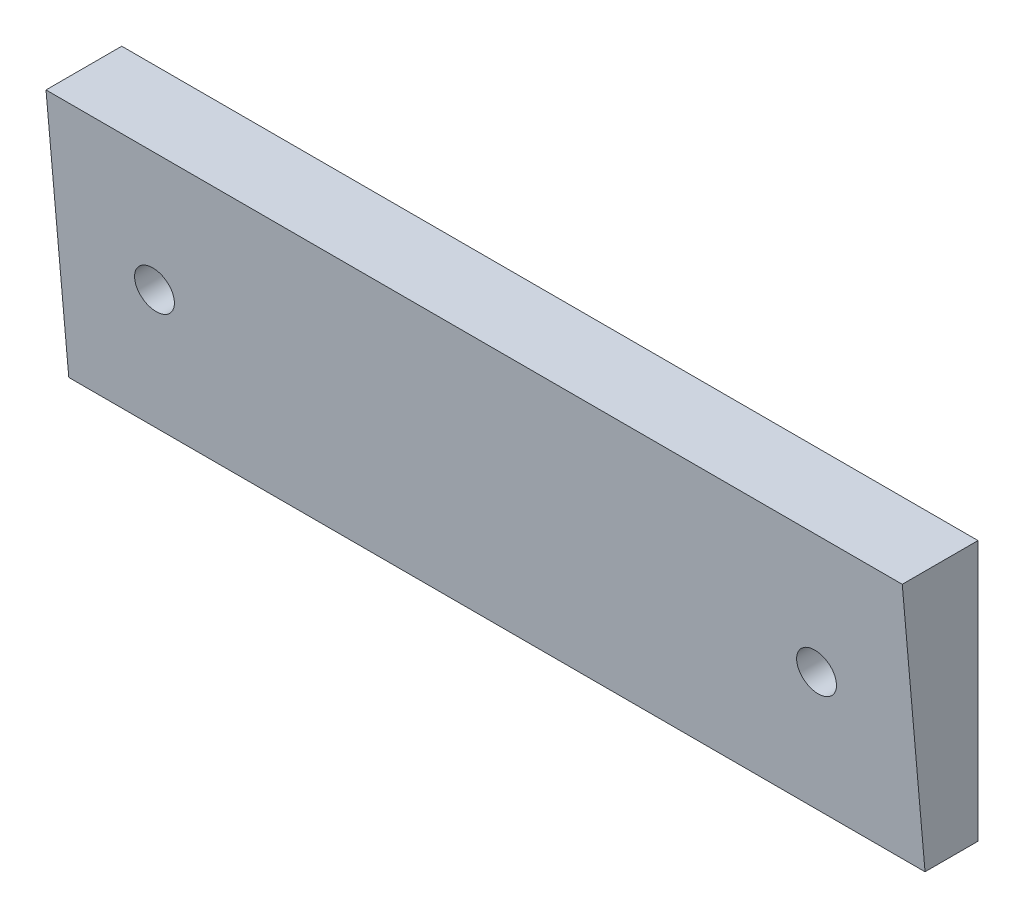
ISO-10303-21;
HEADER;
FILE_DESCRIPTION(('STEP AP214'),'2;1');
FILE_NAME('part.step','',(''),(''),'','','');
FILE_SCHEMA(('AUTOMOTIVE_DESIGN { 1 0 10303 214 1 1 1 1 }'));
ENDSEC;
DATA;
#1=APPLICATION_CONTEXT('core data for automotive mechanical design processes');
#2=APPLICATION_PROTOCOL_DEFINITION('international standard','automotive_design',2000,#1);
#3=PRODUCT_CONTEXT('',#1,'mechanical');
#4=PRODUCT('Part','Part','',(#3));
#5=PRODUCT_RELATED_PRODUCT_CATEGORY('part','',(#4));
#6=PRODUCT_DEFINITION_FORMATION('','',#4);
#7=PRODUCT_DEFINITION_CONTEXT('part definition',#1,'design');
#8=PRODUCT_DEFINITION('design','',#6,#7);
#9=PRODUCT_DEFINITION_SHAPE('','',#8);
#10=(LENGTH_UNIT() NAMED_UNIT(*) SI_UNIT(.MILLI.,.METRE.));
#11=(NAMED_UNIT(*) PLANE_ANGLE_UNIT() SI_UNIT($,.RADIAN.));
#12=(NAMED_UNIT(*) SI_UNIT($,.STERADIAN.) SOLID_ANGLE_UNIT());
#13=UNCERTAINTY_MEASURE_WITH_UNIT(LENGTH_MEASURE(1.E-05),#10,'distance_accuracy_value','');
#14=(GEOMETRIC_REPRESENTATION_CONTEXT(3) GLOBAL_UNCERTAINTY_ASSIGNED_CONTEXT((#13)) GLOBAL_UNIT_ASSIGNED_CONTEXT((#10,
#11,#12)) REPRESENTATION_CONTEXT('',''));
#15=CARTESIAN_POINT('',(0.,0.,0.));
#16=DIRECTION('',(0.,0.,1.));
#17=DIRECTION('',(1.,0.,0.));
#18=AXIS2_PLACEMENT_3D('',#15,#16,#17);
#19=CARTESIAN_POINT('',(48.5,10.,0.));
#20=DIRECTION('',(0.,0.,1.));
#21=DIRECTION('',(1.,0.,0.));
#22=AXIS2_PLACEMENT_3D('',#19,#20,#21);
#23=PLANE('',#22);
#24=CARTESIAN_POINT('',(37.5,-4.75,0.));
#25=DIRECTION('',(0.,0.,1.));
#26=DIRECTION('',(1.,0.,0.));
#27=AXIS2_PLACEMENT_3D('',#24,#25,#26);
#28=CIRCLE('',#27,2.25);
#29=CARTESIAN_POINT('',(39.75,-4.75,0.));
#30=VERTEX_POINT('',#29);
#31=EDGE_CURVE('E113',#30,#30,#28,.T.);
#32=ORIENTED_EDGE('',*,*,#31,.T.);
#33=EDGE_LOOP('',(#32));
#34=FACE_BOUND('',#33,.T.);
#35=CARTESIAN_POINT('',(-37.5,-4.75,0.));
#36=DIRECTION('',(0.,0.,1.));
#37=DIRECTION('',(1.,0.,0.));
#38=AXIS2_PLACEMENT_3D('',#35,#36,#37);
#39=CIRCLE('',#38,2.25);
#40=CARTESIAN_POINT('',(-35.25,-4.75,0.));
#41=VERTEX_POINT('',#40);
#42=EDGE_CURVE('E122',#41,#41,#39,.T.);
#43=ORIENTED_EDGE('',*,*,#42,.T.);
#44=EDGE_LOOP('',(#43));
#45=FACE_BOUND('',#44,.T.);
#46=CARTESIAN_POINT('',(15.,0.,0.));
#47=DIRECTION('',(0.,0.,1.));
#48=DIRECTION('',(1.,0.,0.));
#49=AXIS2_PLACEMENT_3D('',#46,#47,#48);
#50=CIRCLE('',#49,2.);
#51=CARTESIAN_POINT('',(17.,0.,0.));
#52=VERTEX_POINT('',#51);
#53=EDGE_CURVE('E128',#52,#52,#50,.T.);
#54=ORIENTED_EDGE('',*,*,#53,.T.);
#55=EDGE_LOOP('',(#54));
#56=FACE_BOUND('',#55,.T.);
#57=CARTESIAN_POINT('',(-15.,0.,0.));
#58=DIRECTION('',(0.,0.,1.));
#59=DIRECTION('',(1.,0.,0.));
#60=AXIS2_PLACEMENT_3D('',#57,#58,#59);
#61=CIRCLE('',#60,2.);
#62=CARTESIAN_POINT('',(-13.,0.,0.));
#63=VERTEX_POINT('',#62);
#64=EDGE_CURVE('E133',#63,#63,#61,.T.);
#65=ORIENTED_EDGE('',*,*,#64,.T.);
#66=EDGE_LOOP('',(#65));
#67=FACE_BOUND('',#66,.T.);
#68=DIRECTION('',(0.,1.,0.));
#69=VECTOR('',#68,1.);
#70=CARTESIAN_POINT('',(-48.5,10.,0.));
#71=LINE('',#70,#69);
#72=CARTESIAN_POINT('',(-48.5,-19.5,0.));
#73=VERTEX_POINT('',#72);
#74=CARTESIAN_POINT('',(-48.5,10.,0.));
#75=VERTEX_POINT('',#74);
#76=EDGE_CURVE('E104',#73,#75,#71,.T.);
#77=ORIENTED_EDGE('',*,*,#76,.T.);
#78=DIRECTION('',(-1.,0.,0.));
#79=VECTOR('',#78,1.);
#80=CARTESIAN_POINT('',(48.5,10.,0.));
#81=LINE('',#80,#79);
#82=CARTESIAN_POINT('',(48.5,10.,0.));
#83=VERTEX_POINT('',#82);
#84=EDGE_CURVE('E11',#83,#75,#81,.T.);
#85=ORIENTED_EDGE('',*,*,#84,.F.);
#86=DIRECTION('',(0.,1.,0.));
#87=VECTOR('',#86,1.);
#88=CARTESIAN_POINT('',(48.5,10.,0.));
#89=LINE('',#88,#87);
#90=CARTESIAN_POINT('',(48.5,-19.5,0.));
#91=VERTEX_POINT('',#90);
#92=EDGE_CURVE('E95',#91,#83,#89,.T.);
#93=ORIENTED_EDGE('',*,*,#92,.F.);
#94=DIRECTION('',(-1.,0.,0.));
#95=VECTOR('',#94,1.);
#96=CARTESIAN_POINT('',(48.5,-19.5,0.));
#97=LINE('',#96,#95);
#98=EDGE_CURVE('E101',#91,#73,#97,.T.);
#99=ORIENTED_EDGE('',*,*,#98,.T.);
#100=EDGE_LOOP('',(#77,#85,#93,#99));
#101=FACE_BOUND('',#100,.T.);
#102=ADVANCED_FACE('F39',(#34,#45,#56,#67,#101),#23,.F.);
#103=CARTESIAN_POINT('',(48.5,10.,8.58091557401476));
#104=DIRECTION('',(0.,-1.,0.));
#105=DIRECTION('',(0.,0.,-1.));
#106=AXIS2_PLACEMENT_3D('',#103,#104,#105);
#107=PLANE('',#106);
#108=DIRECTION('',(0.,0.,1.));
#109=VECTOR('',#108,1.);
#110=CARTESIAN_POINT('',(-48.5,10.,8.58091557401476));
#111=LINE('',#110,#109);
#112=CARTESIAN_POINT('',(-48.5,10.,8.58091557401476));
#113=VERTEX_POINT('',#112);
#114=EDGE_CURVE('E96',#75,#113,#111,.T.);
#115=ORIENTED_EDGE('',*,*,#114,.T.);
#116=DIRECTION('',(-1.,0.,0.));
#117=VECTOR('',#116,1.);
#118=CARTESIAN_POINT('',(48.5,10.,8.58091557401476));
#119=LINE('',#118,#117);
#120=CARTESIAN_POINT('',(48.5,10.,8.58091557401476));
#121=VERTEX_POINT('',#120);
#122=EDGE_CURVE('E48',#121,#113,#119,.T.);
#123=ORIENTED_EDGE('',*,*,#122,.F.);
#124=DIRECTION('',(0.,0.,1.));
#125=VECTOR('',#124,1.);
#126=CARTESIAN_POINT('',(48.5,10.,8.58091557401476));
#127=LINE('',#126,#125);
#128=EDGE_CURVE('E87',#83,#121,#127,.T.);
#129=ORIENTED_EDGE('',*,*,#128,.F.);
#130=ORIENTED_EDGE('',*,*,#84,.T.);
#131=EDGE_LOOP('',(#115,#123,#129,#130));
#132=FACE_BOUND('',#131,.T.);
#133=ADVANCED_FACE('F92',(#132),#107,.F.);
#134=CARTESIAN_POINT('',(48.5,-19.5,6.));
#135=DIRECTION('',(0.,0.0871557427476582,-0.996194698091745));
#136=DIRECTION('',(0.,0.996194698091746,0.0871557427476582));
#137=AXIS2_PLACEMENT_3D('',#134,#135,#136);
#138=PLANE('',#137);
#139=CARTESIAN_POINT('',(37.5,-4.75,7.29045778700738));
#140=DIRECTION('',(0.,0.0871557427476582,-0.996194698091745));
#141=DIRECTION('',(0.,-0.996194698091746,-0.0871557427476582));
#142=AXIS2_PLACEMENT_3D('',#139,#140,#141);
#143=ELLIPSE('',#142,2.25859463447253,2.25);
#144=CARTESIAN_POINT('',(37.5,-7.,7.09360829407405));
#145=VERTEX_POINT('',#144);
#146=EDGE_CURVE('E45',#145,#145,#143,.F.);
#147=ORIENTED_EDGE('',*,*,#146,.F.);
#148=EDGE_LOOP('',(#147));
#149=FACE_BOUND('',#148,.T.);
#150=CARTESIAN_POINT('',(-37.5,-4.75,7.29045778700738));
#151=DIRECTION('',(0.,0.0871557427476582,-0.996194698091745));
#152=DIRECTION('',(0.,-0.996194698091746,-0.0871557427476582));
#153=AXIS2_PLACEMENT_3D('',#150,#151,#152);
#154=ELLIPSE('',#153,2.25859463447253,2.25);
#155=CARTESIAN_POINT('',(-37.5,-7.,7.09360829407405));
#156=VERTEX_POINT('',#155);
#157=EDGE_CURVE('E114',#156,#156,#154,.F.);
#158=ORIENTED_EDGE('',*,*,#157,.F.);
#159=EDGE_LOOP('',(#158));
#160=FACE_BOUND('',#159,.T.);
#161=DIRECTION('',(0.,-0.996194698091745,-0.0871557427476582));
#162=VECTOR('',#161,1.);
#163=CARTESIAN_POINT('',(-48.5,-19.5,6.));
#164=LINE('',#163,#162);
#165=CARTESIAN_POINT('',(-48.5,-19.5,6.));
#166=VERTEX_POINT('',#165);
#167=EDGE_CURVE('E74',#113,#166,#164,.T.);
#168=ORIENTED_EDGE('',*,*,#167,.T.);
#169=DIRECTION('',(-1.,0.,0.));
#170=VECTOR('',#169,1.);
#171=CARTESIAN_POINT('',(48.5,-19.5,6.));
#172=LINE('',#171,#170);
#173=CARTESIAN_POINT('',(48.5,-19.5,6.));
#174=VERTEX_POINT('',#173);
#175=EDGE_CURVE('E100',#174,#166,#172,.T.);
#176=ORIENTED_EDGE('',*,*,#175,.F.);
#177=DIRECTION('',(0.,-0.996194698091745,-0.0871557427476582));
#178=VECTOR('',#177,1.);
#179=CARTESIAN_POINT('',(48.5,-19.5,6.));
#180=LINE('',#179,#178);
#181=EDGE_CURVE('E89',#121,#174,#180,.T.);
#182=ORIENTED_EDGE('',*,*,#181,.F.);
#183=ORIENTED_EDGE('',*,*,#122,.T.);
#184=EDGE_LOOP('',(#168,#176,#182,#183));
#185=FACE_BOUND('',#184,.T.);
#186=ADVANCED_FACE('F97',(#149,#160,#185),#138,.F.);
#187=CARTESIAN_POINT('',(48.5,-19.5,0.));
#188=DIRECTION('',(0.,1.,0.));
#189=DIRECTION('',(0.,0.,1.));
#190=AXIS2_PLACEMENT_3D('',#187,#188,#189);
#191=PLANE('',#190);
#192=DIRECTION('',(0.,0.,-1.));
#193=VECTOR('',#192,1.);
#194=CARTESIAN_POINT('',(-48.5,-19.5,0.));
#195=LINE('',#194,#193);
#196=EDGE_CURVE('E76',#166,#73,#195,.T.);
#197=ORIENTED_EDGE('',*,*,#196,.T.);
#198=ORIENTED_EDGE('',*,*,#98,.F.);
#199=DIRECTION('',(0.,0.,-1.));
#200=VECTOR('',#199,1.);
#201=CARTESIAN_POINT('',(48.5,-19.5,0.));
#202=LINE('',#201,#200);
#203=EDGE_CURVE('E60',#174,#91,#202,.T.);
#204=ORIENTED_EDGE('',*,*,#203,.F.);
#205=ORIENTED_EDGE('',*,*,#175,.T.);
#206=EDGE_LOOP('',(#197,#198,#204,#205));
#207=FACE_BOUND('',#206,.T.);
#208=ADVANCED_FACE('F177',(#207),#191,.F.);
#209=CARTESIAN_POINT('',(48.5,0.,0.));
#210=DIRECTION('',(-1.,0.,0.));
#211=DIRECTION('',(0.,0.,1.));
#212=AXIS2_PLACEMENT_3D('',#209,#210,#211);
#213=PLANE('',#212);
#214=ORIENTED_EDGE('',*,*,#92,.T.);
#215=ORIENTED_EDGE('',*,*,#128,.T.);
#216=ORIENTED_EDGE('',*,*,#181,.T.);
#217=ORIENTED_EDGE('',*,*,#203,.T.);
#218=EDGE_LOOP('',(#214,#215,#216,#217));
#219=FACE_BOUND('',#218,.T.);
#220=ADVANCED_FACE('F86',(#219),#213,.F.);
#221=CARTESIAN_POINT('',(-48.5,0.,0.));
#222=DIRECTION('',(-1.,0.,0.));
#223=DIRECTION('',(0.,0.,1.));
#224=AXIS2_PLACEMENT_3D('',#221,#222,#223);
#225=PLANE('',#224);
#226=ORIENTED_EDGE('',*,*,#76,.F.);
#227=ORIENTED_EDGE('',*,*,#196,.F.);
#228=ORIENTED_EDGE('',*,*,#167,.F.);
#229=ORIENTED_EDGE('',*,*,#114,.F.);
#230=EDGE_LOOP('',(#226,#227,#228,#229));
#231=FACE_BOUND('',#230,.T.);
#232=ADVANCED_FACE('F153',(#231),#225,.T.);
#233=CARTESIAN_POINT('',(-15.,0.,5.7));
#234=DIRECTION('',(0.,0.,-1.));
#235=DIRECTION('',(-1.,0.,0.));
#236=AXIS2_PLACEMENT_3D('',#233,#234,#235);
#237=CYLINDRICAL_SURFACE('',#236,2.);
#238=CARTESIAN_POINT('',(-15.,0.,5.7));
#239=DIRECTION('',(0.,0.,1.));
#240=DIRECTION('',(1.,0.,0.));
#241=AXIS2_PLACEMENT_3D('',#238,#239,#240);
#242=CIRCLE('',#241,2.);
#243=CARTESIAN_POINT('',(-13.,0.,5.7));
#244=VERTEX_POINT('',#243);
#245=EDGE_CURVE('E119',#244,#244,#242,.T.);
#246=ORIENTED_EDGE('',*,*,#245,.T.);
#247=EDGE_LOOP('',(#246));
#248=FACE_BOUND('',#247,.T.);
#249=ORIENTED_EDGE('',*,*,#64,.F.);
#250=EDGE_LOOP('',(#249));
#251=FACE_BOUND('',#250,.T.);
#252=ADVANCED_FACE('F136',(#248,#251),#237,.F.);
#253=CARTESIAN_POINT('',(-15.,0.,5.7));
#254=DIRECTION('',(0.,0.,1.));
#255=DIRECTION('',(1.,0.,0.));
#256=AXIS2_PLACEMENT_3D('',#253,#254,#255);
#257=PLANE('',#256);
#258=ORIENTED_EDGE('',*,*,#245,.F.);
#259=EDGE_LOOP('',(#258));
#260=FACE_BOUND('',#259,.T.);
#261=ADVANCED_FACE('F142',(#260),#257,.F.);
#262=CARTESIAN_POINT('',(15.,0.,5.7));
#263=DIRECTION('',(0.,0.,-1.));
#264=DIRECTION('',(-1.,0.,0.));
#265=AXIS2_PLACEMENT_3D('',#262,#263,#264);
#266=CYLINDRICAL_SURFACE('',#265,2.);
#267=CARTESIAN_POINT('',(15.,0.,5.7));
#268=DIRECTION('',(0.,0.,1.));
#269=DIRECTION('',(1.,0.,0.));
#270=AXIS2_PLACEMENT_3D('',#267,#268,#269);
#271=CIRCLE('',#270,2.);
#272=CARTESIAN_POINT('',(17.,0.,5.7));
#273=VERTEX_POINT('',#272);
#274=EDGE_CURVE('E107',#273,#273,#271,.T.);
#275=ORIENTED_EDGE('',*,*,#274,.T.);
#276=EDGE_LOOP('',(#275));
#277=FACE_BOUND('',#276,.T.);
#278=ORIENTED_EDGE('',*,*,#53,.F.);
#279=EDGE_LOOP('',(#278));
#280=FACE_BOUND('',#279,.T.);
#281=ADVANCED_FACE('F145',(#277,#280),#266,.F.);
#282=CARTESIAN_POINT('',(15.,0.,5.7));
#283=DIRECTION('',(0.,0.,1.));
#284=DIRECTION('',(1.,0.,0.));
#285=AXIS2_PLACEMENT_3D('',#282,#283,#284);
#286=PLANE('',#285);
#287=ORIENTED_EDGE('',*,*,#274,.F.);
#288=EDGE_LOOP('',(#287));
#289=FACE_BOUND('',#288,.T.);
#290=ADVANCED_FACE('F147',(#289),#286,.F.);
#291=CARTESIAN_POINT('',(-37.5,-4.75,12.));
#292=DIRECTION('',(0.,0.,-1.));
#293=DIRECTION('',(-1.,0.,0.));
#294=AXIS2_PLACEMENT_3D('',#291,#292,#293);
#295=CYLINDRICAL_SURFACE('',#294,2.25);
#296=ORIENTED_EDGE('',*,*,#42,.F.);
#297=EDGE_LOOP('',(#296));
#298=FACE_BOUND('',#297,.T.);
#299=ORIENTED_EDGE('',*,*,#157,.T.);
#300=EDGE_LOOP('',(#299));
#301=FACE_BOUND('',#300,.T.);
#302=ADVANCED_FACE('F189',(#298,#301),#295,.F.);
#303=CARTESIAN_POINT('',(37.5,-4.75,12.));
#304=DIRECTION('',(0.,0.,-1.));
#305=DIRECTION('',(-1.,0.,0.));
#306=AXIS2_PLACEMENT_3D('',#303,#304,#305);
#307=CYLINDRICAL_SURFACE('',#306,2.25);
#308=ORIENTED_EDGE('',*,*,#31,.F.);
#309=EDGE_LOOP('',(#308));
#310=FACE_BOUND('',#309,.T.);
#311=ORIENTED_EDGE('',*,*,#146,.T.);
#312=EDGE_LOOP('',(#311));
#313=FACE_BOUND('',#312,.T.);
#314=ADVANCED_FACE('F190',(#310,#313),#307,.F.);
#315=CLOSED_SHELL('',(#102,#133,#186,#208,#220,#232,#252,#261,#281,#290,#302,#314));
#316=MANIFOLD_SOLID_BREP('B2',#315);
#317=ADVANCED_BREP_SHAPE_REPRESENTATION('',(#18,#316),#14);
#318=SHAPE_DEFINITION_REPRESENTATION(#9,#317);
ENDSEC;
END-ISO-10303-21;
